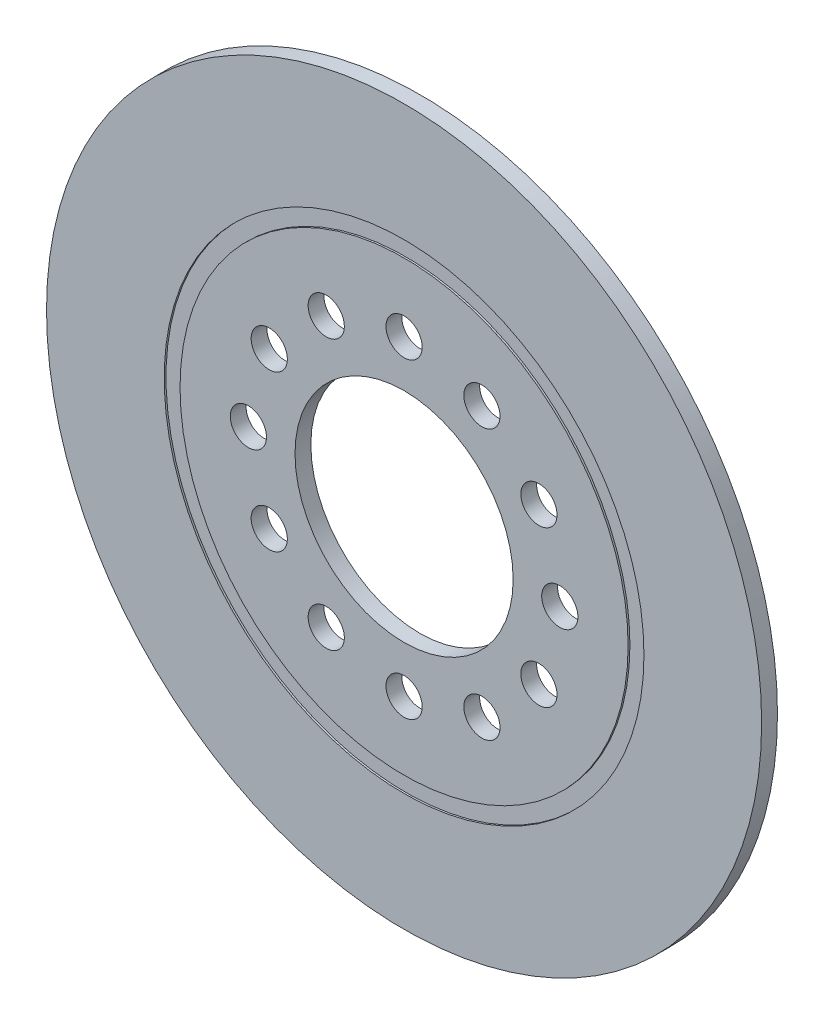
ISO-10303-21;
HEADER;
FILE_DESCRIPTION(('STEP AP214'),'2;1');
FILE_NAME('part.step','',(''),(''),'','','');
FILE_SCHEMA(('AUTOMOTIVE_DESIGN { 1 0 10303 214 1 1 1 1 }'));
ENDSEC;
DATA;
#1=APPLICATION_CONTEXT('core data for automotive mechanical design processes');
#2=APPLICATION_PROTOCOL_DEFINITION('international standard','automotive_design',2000,#1);
#3=PRODUCT_CONTEXT('',#1,'mechanical');
#4=PRODUCT('Part','Part','',(#3));
#5=PRODUCT_RELATED_PRODUCT_CATEGORY('part','',(#4));
#6=PRODUCT_DEFINITION_FORMATION('','',#4);
#7=PRODUCT_DEFINITION_CONTEXT('part definition',#1,'design');
#8=PRODUCT_DEFINITION('design','',#6,#7);
#9=PRODUCT_DEFINITION_SHAPE('','',#8);
#10=(LENGTH_UNIT() NAMED_UNIT(*) SI_UNIT(.MILLI.,.METRE.));
#11=(NAMED_UNIT(*) PLANE_ANGLE_UNIT() SI_UNIT($,.RADIAN.));
#12=(NAMED_UNIT(*) SI_UNIT($,.STERADIAN.) SOLID_ANGLE_UNIT());
#13=UNCERTAINTY_MEASURE_WITH_UNIT(LENGTH_MEASURE(1.E-05),#10,'distance_accuracy_value','');
#14=(GEOMETRIC_REPRESENTATION_CONTEXT(3) GLOBAL_UNCERTAINTY_ASSIGNED_CONTEXT((#13)) GLOBAL_UNIT_ASSIGNED_CONTEXT((#10,
#11,#12)) REPRESENTATION_CONTEXT('',''));
#15=CARTESIAN_POINT('',(0.,0.,0.));
#16=DIRECTION('',(0.,0.,1.));
#17=DIRECTION('',(1.,0.,0.));
#18=AXIS2_PLACEMENT_3D('',#15,#16,#17);
#19=CARTESIAN_POINT('',(0.,0.,3.5));
#20=DIRECTION('',(0.,0.,1.));
#21=DIRECTION('',(1.,0.,0.));
#22=AXIS2_PLACEMENT_3D('',#19,#20,#21);
#23=PLANE('',#22);
#24=CARTESIAN_POINT('',(34.4,0.,3.5));
#25=DIRECTION('',(0.,0.,1.));
#26=DIRECTION('',(1.,0.,0.));
#27=AXIS2_PLACEMENT_3D('',#24,#25,#26);
#28=CIRCLE('',#27,4.00000000000001);
#29=CARTESIAN_POINT('',(38.4,0.,3.5));
#30=VERTEX_POINT('',#29);
#31=EDGE_CURVE('E42',#30,#30,#28,.T.);
#32=ORIENTED_EDGE('',*,*,#31,.F.);
#33=EDGE_LOOP('',(#32));
#34=FACE_BOUND('',#33,.T.);
#35=CARTESIAN_POINT('',(29.7912738901849,17.1999999999996,3.5));
#36=DIRECTION('',(0.,0.,1.));
#37=DIRECTION('',(1.,0.,0.));
#38=AXIS2_PLACEMENT_3D('',#35,#36,#37);
#39=CIRCLE('',#38,4.);
#40=CARTESIAN_POINT('',(33.7912738901849,17.1999999999996,3.5));
#41=VERTEX_POINT('',#40);
#42=EDGE_CURVE('E101',#41,#41,#39,.T.);
#43=ORIENTED_EDGE('',*,*,#42,.F.);
#44=EDGE_LOOP('',(#43));
#45=FACE_BOUND('',#44,.T.);
#46=CARTESIAN_POINT('',(17.2000000000003,29.7912738901845,3.5));
#47=DIRECTION('',(0.,0.,1.));
#48=DIRECTION('',(1.,0.,0.));
#49=AXIS2_PLACEMENT_3D('',#46,#47,#48);
#50=CIRCLE('',#49,4.00000000000001);
#51=CARTESIAN_POINT('',(21.2000000000004,29.7912738901845,3.5));
#52=VERTEX_POINT('',#51);
#53=EDGE_CURVE('E108',#52,#52,#50,.T.);
#54=ORIENTED_EDGE('',*,*,#53,.F.);
#55=EDGE_LOOP('',(#54));
#56=FACE_BOUND('',#55,.T.);
#57=CARTESIAN_POINT('',(3.60320874168611E-13,34.4,3.5));
#58=DIRECTION('',(0.,0.,1.));
#59=DIRECTION('',(1.,0.,0.));
#60=AXIS2_PLACEMENT_3D('',#57,#58,#59);
#61=CIRCLE('',#60,4.00000000000001);
#62=CARTESIAN_POINT('',(4.00000000000037,34.4,3.5));
#63=VERTEX_POINT('',#62);
#64=EDGE_CURVE('E114',#63,#63,#61,.T.);
#65=ORIENTED_EDGE('',*,*,#64,.F.);
#66=EDGE_LOOP('',(#65));
#67=FACE_BOUND('',#66,.T.);
#68=CARTESIAN_POINT('',(-17.1999999999997,29.7912738901849,3.5));
#69=DIRECTION('',(0.,0.,1.));
#70=DIRECTION('',(1.,0.,0.));
#71=AXIS2_PLACEMENT_3D('',#68,#69,#70);
#72=CIRCLE('',#71,4.00000000000001);
#73=CARTESIAN_POINT('',(-13.1999999999997,29.7912738901849,3.5));
#74=VERTEX_POINT('',#73);
#75=EDGE_CURVE('E78',#74,#74,#72,.T.);
#76=ORIENTED_EDGE('',*,*,#75,.F.);
#77=EDGE_LOOP('',(#76));
#78=FACE_BOUND('',#77,.T.);
#79=CARTESIAN_POINT('',(0.,0.,3.5));
#80=DIRECTION('',(0.,0.,1.));
#81=DIRECTION('',(1.,0.,0.));
#82=AXIS2_PLACEMENT_3D('',#79,#80,#81);
#83=CIRCLE('',#82,24.1);
#84=CARTESIAN_POINT('',(24.1,0.,3.5));
#85=VERTEX_POINT('',#84);
#86=EDGE_CURVE('E47',#85,#85,#83,.T.);
#87=ORIENTED_EDGE('',*,*,#86,.F.);
#88=EDGE_LOOP('',(#87));
#89=FACE_BOUND('',#88,.T.);
#90=CARTESIAN_POINT('',(29.7912738901847,-17.2,3.5));
#91=DIRECTION('',(0.,0.,1.));
#92=DIRECTION('',(1.,0.,0.));
#93=AXIS2_PLACEMENT_3D('',#90,#91,#92);
#94=CIRCLE('',#93,4.00000000000001);
#95=CARTESIAN_POINT('',(33.7912738901847,-17.2,3.5));
#96=VERTEX_POINT('',#95);
#97=EDGE_CURVE('E66',#96,#96,#94,.T.);
#98=ORIENTED_EDGE('',*,*,#97,.F.);
#99=EDGE_LOOP('',(#98));
#100=FACE_BOUND('',#99,.T.);
#101=CARTESIAN_POINT('',(17.1999999999999,-29.7912738901847,3.5));
#102=DIRECTION('',(0.,0.,1.));
#103=DIRECTION('',(1.,0.,0.));
#104=AXIS2_PLACEMENT_3D('',#101,#102,#103);
#105=CIRCLE('',#104,4.00000000000001);
#106=CARTESIAN_POINT('',(21.1999999999999,-29.7912738901847,3.5));
#107=VERTEX_POINT('',#106);
#108=EDGE_CURVE('E60',#107,#107,#105,.T.);
#109=ORIENTED_EDGE('',*,*,#108,.F.);
#110=EDGE_LOOP('',(#109));
#111=FACE_BOUND('',#110,.T.);
#112=CARTESIAN_POINT('',(-1.20106958056204E-13,-34.4,3.5));
#113=DIRECTION('',(0.,0.,1.));
#114=DIRECTION('',(1.,0.,0.));
#115=AXIS2_PLACEMENT_3D('',#112,#113,#114);
#116=CIRCLE('',#115,4.00000000000001);
#117=CARTESIAN_POINT('',(3.99999999999989,-34.4,3.5));
#118=VERTEX_POINT('',#117);
#119=EDGE_CURVE('E53',#118,#118,#116,.T.);
#120=ORIENTED_EDGE('',*,*,#119,.F.);
#121=EDGE_LOOP('',(#120));
#122=FACE_BOUND('',#121,.T.);
#123=CARTESIAN_POINT('',(-17.2000000000001,-29.7912738901846,3.5));
#124=DIRECTION('',(0.,0.,1.));
#125=DIRECTION('',(1.,0.,0.));
#126=AXIS2_PLACEMENT_3D('',#123,#124,#125);
#127=CIRCLE('',#126,4.00000000000001);
#128=CARTESIAN_POINT('',(-13.2000000000001,-29.7912738901846,3.5));
#129=VERTEX_POINT('',#128);
#130=EDGE_CURVE('E54',#129,#129,#127,.T.);
#131=ORIENTED_EDGE('',*,*,#130,.F.);
#132=EDGE_LOOP('',(#131));
#133=FACE_BOUND('',#132,.T.);
#134=CARTESIAN_POINT('',(-29.7912738901848,-17.1999999999998,3.5));
#135=DIRECTION('',(0.,0.,1.));
#136=DIRECTION('',(1.,0.,0.));
#137=AXIS2_PLACEMENT_3D('',#134,#135,#136);
#138=CIRCLE('',#137,4.);
#139=CARTESIAN_POINT('',(-25.7912738901848,-17.1999999999998,3.5));
#140=VERTEX_POINT('',#139);
#141=EDGE_CURVE('E90',#140,#140,#138,.T.);
#142=ORIENTED_EDGE('',*,*,#141,.F.);
#143=EDGE_LOOP('',(#142));
#144=FACE_BOUND('',#143,.T.);
#145=CARTESIAN_POINT('',(-34.4,2.40213916112408E-13,3.5));
#146=DIRECTION('',(0.,0.,1.));
#147=DIRECTION('',(1.,0.,0.));
#148=AXIS2_PLACEMENT_3D('',#145,#146,#147);
#149=CIRCLE('',#148,4.00000000000001);
#150=CARTESIAN_POINT('',(-30.4,2.40213916112408E-13,3.5));
#151=VERTEX_POINT('',#150);
#152=EDGE_CURVE('E84',#151,#151,#149,.T.);
#153=ORIENTED_EDGE('',*,*,#152,.F.);
#154=EDGE_LOOP('',(#153));
#155=FACE_BOUND('',#154,.T.);
#156=CARTESIAN_POINT('',(-29.7912738901845,17.2000000000002,3.5));
#157=DIRECTION('',(0.,0.,1.));
#158=DIRECTION('',(1.,0.,0.));
#159=AXIS2_PLACEMENT_3D('',#156,#157,#158);
#160=CIRCLE('',#159,4.00000000000001);
#161=CARTESIAN_POINT('',(-25.7912738901845,17.2000000000002,3.5));
#162=VERTEX_POINT('',#161);
#163=EDGE_CURVE('E77',#162,#162,#160,.T.);
#164=ORIENTED_EDGE('',*,*,#163,.F.);
#165=EDGE_LOOP('',(#164));
#166=FACE_BOUND('',#165,.T.);
#167=CARTESIAN_POINT('',(0.,0.,3.5));
#168=DIRECTION('',(0.,0.,1.));
#169=DIRECTION('',(1.,0.,0.));
#170=AXIS2_PLACEMENT_3D('',#167,#168,#169);
#171=CIRCLE('',#170,49.5);
#172=CARTESIAN_POINT('',(49.5,0.,3.5));
#173=VERTEX_POINT('',#172);
#174=EDGE_CURVE('E128',#173,#173,#171,.T.);
#175=ORIENTED_EDGE('',*,*,#174,.T.);
#176=EDGE_LOOP('',(#175));
#177=FACE_BOUND('',#176,.T.);
#178=ADVANCED_FACE('F31',(#34,#45,#56,#67,#78,#89,#100,#111,#122,#133,#144,#155,#166,#177),#23,.T.);
#179=CARTESIAN_POINT('',(0.,0.,3.5));
#180=DIRECTION('',(0.,0.,-1.));
#181=DIRECTION('',(-1.,0.,0.));
#182=AXIS2_PLACEMENT_3D('',#179,#180,#181);
#183=CYLINDRICAL_SURFACE('',#182,79.);
#184=CARTESIAN_POINT('',(0.,0.,3.5));
#185=DIRECTION('',(0.,0.,1.));
#186=DIRECTION('',(1.,0.,0.));
#187=AXIS2_PLACEMENT_3D('',#184,#185,#186);
#188=CIRCLE('',#187,79.);
#189=CARTESIAN_POINT('',(79.,0.,3.5));
#190=VERTEX_POINT('',#189);
#191=EDGE_CURVE('E10',#190,#190,#188,.T.);
#192=ORIENTED_EDGE('',*,*,#191,.F.);
#193=EDGE_LOOP('',(#192));
#194=FACE_BOUND('',#193,.T.);
#195=CARTESIAN_POINT('',(0.,0.,0.));
#196=DIRECTION('',(0.,0.,1.));
#197=DIRECTION('',(1.,0.,0.));
#198=AXIS2_PLACEMENT_3D('',#195,#196,#197);
#199=CIRCLE('',#198,79.);
#200=CARTESIAN_POINT('',(79.,0.,0.));
#201=VERTEX_POINT('',#200);
#202=EDGE_CURVE('E35',#201,#201,#199,.T.);
#203=ORIENTED_EDGE('',*,*,#202,.T.);
#204=EDGE_LOOP('',(#203));
#205=FACE_BOUND('',#204,.T.);
#206=ADVANCED_FACE('F33',(#194,#205),#183,.T.);
#207=CARTESIAN_POINT('',(0.,0.,3.5));
#208=DIRECTION('',(0.,0.,1.));
#209=DIRECTION('',(1.,0.,0.));
#210=AXIS2_PLACEMENT_3D('',#207,#208,#209);
#211=CIRCLE('',#210,53.);
#212=CARTESIAN_POINT('',(53.,0.,3.5));
#213=VERTEX_POINT('',#212);
#214=EDGE_CURVE('E122',#213,#213,#211,.T.);
#215=ORIENTED_EDGE('',*,*,#214,.F.);
#216=EDGE_LOOP('',(#215));
#217=FACE_BOUND('',#216,.T.);
#218=ORIENTED_EDGE('',*,*,#191,.T.);
#219=EDGE_LOOP('',(#218));
#220=FACE_BOUND('',#219,.T.);
#221=ADVANCED_FACE('F150',(#217,#220),#23,.T.);
#222=CARTESIAN_POINT('',(0.,0.,0.));
#223=DIRECTION('',(0.,0.,1.));
#224=DIRECTION('',(1.,0.,0.));
#225=AXIS2_PLACEMENT_3D('',#222,#223,#224);
#226=PLANE('',#225);
#227=CARTESIAN_POINT('',(-29.7912738901845,17.2000000000002,0.));
#228=DIRECTION('',(0.,0.,1.));
#229=DIRECTION('',(1.,0.,0.));
#230=AXIS2_PLACEMENT_3D('',#227,#228,#229);
#231=CIRCLE('',#230,4.00000000000001);
#232=CARTESIAN_POINT('',(-25.7912738901845,17.2000000000002,0.));
#233=VERTEX_POINT('',#232);
#234=EDGE_CURVE('E74',#233,#233,#231,.T.);
#235=ORIENTED_EDGE('',*,*,#234,.T.);
#236=EDGE_LOOP('',(#235));
#237=FACE_BOUND('',#236,.T.);
#238=CARTESIAN_POINT('',(-34.4,2.40213916112408E-13,0.));
#239=DIRECTION('',(0.,0.,1.));
#240=DIRECTION('',(1.,0.,0.));
#241=AXIS2_PLACEMENT_3D('',#238,#239,#240);
#242=CIRCLE('',#241,4.00000000000001);
#243=CARTESIAN_POINT('',(-30.4,2.40213916112408E-13,0.));
#244=VERTEX_POINT('',#243);
#245=EDGE_CURVE('E81',#244,#244,#242,.T.);
#246=ORIENTED_EDGE('',*,*,#245,.T.);
#247=EDGE_LOOP('',(#246));
#248=FACE_BOUND('',#247,.T.);
#249=CARTESIAN_POINT('',(-29.7912738901848,-17.1999999999998,0.));
#250=DIRECTION('',(0.,0.,1.));
#251=DIRECTION('',(1.,0.,0.));
#252=AXIS2_PLACEMENT_3D('',#249,#250,#251);
#253=CIRCLE('',#252,4.);
#254=CARTESIAN_POINT('',(-25.7912738901848,-17.1999999999998,0.));
#255=VERTEX_POINT('',#254);
#256=EDGE_CURVE('E87',#255,#255,#253,.T.);
#257=ORIENTED_EDGE('',*,*,#256,.T.);
#258=EDGE_LOOP('',(#257));
#259=FACE_BOUND('',#258,.T.);
#260=CARTESIAN_POINT('',(-17.2000000000001,-29.7912738901846,0.));
#261=DIRECTION('',(0.,0.,1.));
#262=DIRECTION('',(1.,0.,0.));
#263=AXIS2_PLACEMENT_3D('',#260,#261,#262);
#264=CIRCLE('',#263,4.00000000000001);
#265=CARTESIAN_POINT('',(-13.2000000000001,-29.7912738901846,0.));
#266=VERTEX_POINT('',#265);
#267=EDGE_CURVE('E93',#266,#266,#264,.T.);
#268=ORIENTED_EDGE('',*,*,#267,.T.);
#269=EDGE_LOOP('',(#268));
#270=FACE_BOUND('',#269,.T.);
#271=CARTESIAN_POINT('',(-1.20106958056204E-13,-34.4,0.));
#272=DIRECTION('',(0.,0.,1.));
#273=DIRECTION('',(1.,0.,0.));
#274=AXIS2_PLACEMENT_3D('',#271,#272,#273);
#275=CIRCLE('',#274,4.00000000000001);
#276=CARTESIAN_POINT('',(3.99999999999989,-34.4,0.));
#277=VERTEX_POINT('',#276);
#278=EDGE_CURVE('E50',#277,#277,#275,.T.);
#279=ORIENTED_EDGE('',*,*,#278,.T.);
#280=EDGE_LOOP('',(#279));
#281=FACE_BOUND('',#280,.T.);
#282=CARTESIAN_POINT('',(17.1999999999999,-29.7912738901847,0.));
#283=DIRECTION('',(0.,0.,1.));
#284=DIRECTION('',(1.,0.,0.));
#285=AXIS2_PLACEMENT_3D('',#282,#283,#284);
#286=CIRCLE('',#285,4.00000000000001);
#287=CARTESIAN_POINT('',(21.1999999999999,-29.7912738901847,0.));
#288=VERTEX_POINT('',#287);
#289=EDGE_CURVE('E57',#288,#288,#286,.T.);
#290=ORIENTED_EDGE('',*,*,#289,.T.);
#291=EDGE_LOOP('',(#290));
#292=FACE_BOUND('',#291,.T.);
#293=CARTESIAN_POINT('',(29.7912738901847,-17.2,0.));
#294=DIRECTION('',(0.,0.,1.));
#295=DIRECTION('',(1.,0.,0.));
#296=AXIS2_PLACEMENT_3D('',#293,#294,#295);
#297=CIRCLE('',#296,4.00000000000001);
#298=CARTESIAN_POINT('',(33.7912738901847,-17.2,0.));
#299=VERTEX_POINT('',#298);
#300=EDGE_CURVE('E63',#299,#299,#297,.T.);
#301=ORIENTED_EDGE('',*,*,#300,.T.);
#302=EDGE_LOOP('',(#301));
#303=FACE_BOUND('',#302,.T.);
#304=CARTESIAN_POINT('',(0.,0.,0.));
#305=DIRECTION('',(0.,0.,1.));
#306=DIRECTION('',(1.,0.,0.));
#307=AXIS2_PLACEMENT_3D('',#304,#305,#306);
#308=CIRCLE('',#307,24.1);
#309=CARTESIAN_POINT('',(24.1,0.,0.));
#310=VERTEX_POINT('',#309);
#311=EDGE_CURVE('E69',#310,#310,#308,.T.);
#312=ORIENTED_EDGE('',*,*,#311,.T.);
#313=EDGE_LOOP('',(#312));
#314=FACE_BOUND('',#313,.T.);
#315=CARTESIAN_POINT('',(-17.1999999999997,29.7912738901849,0.));
#316=DIRECTION('',(0.,0.,1.));
#317=DIRECTION('',(1.,0.,0.));
#318=AXIS2_PLACEMENT_3D('',#315,#316,#317);
#319=CIRCLE('',#318,4.00000000000001);
#320=CARTESIAN_POINT('',(-13.1999999999997,29.7912738901849,0.));
#321=VERTEX_POINT('',#320);
#322=EDGE_CURVE('E117',#321,#321,#319,.T.);
#323=ORIENTED_EDGE('',*,*,#322,.T.);
#324=EDGE_LOOP('',(#323));
#325=FACE_BOUND('',#324,.T.);
#326=CARTESIAN_POINT('',(3.60320874168611E-13,34.4,0.));
#327=DIRECTION('',(0.,0.,1.));
#328=DIRECTION('',(1.,0.,0.));
#329=AXIS2_PLACEMENT_3D('',#326,#327,#328);
#330=CIRCLE('',#329,4.00000000000001);
#331=CARTESIAN_POINT('',(4.00000000000037,34.4,0.));
#332=VERTEX_POINT('',#331);
#333=EDGE_CURVE('E111',#332,#332,#330,.T.);
#334=ORIENTED_EDGE('',*,*,#333,.T.);
#335=EDGE_LOOP('',(#334));
#336=FACE_BOUND('',#335,.T.);
#337=CARTESIAN_POINT('',(17.2000000000003,29.7912738901845,0.));
#338=DIRECTION('',(0.,0.,1.));
#339=DIRECTION('',(1.,0.,0.));
#340=AXIS2_PLACEMENT_3D('',#337,#338,#339);
#341=CIRCLE('',#340,4.00000000000001);
#342=CARTESIAN_POINT('',(21.2000000000004,29.7912738901845,0.));
#343=VERTEX_POINT('',#342);
#344=EDGE_CURVE('E105',#343,#343,#341,.T.);
#345=ORIENTED_EDGE('',*,*,#344,.T.);
#346=EDGE_LOOP('',(#345));
#347=FACE_BOUND('',#346,.T.);
#348=CARTESIAN_POINT('',(29.7912738901849,17.1999999999996,0.));
#349=DIRECTION('',(0.,0.,1.));
#350=DIRECTION('',(1.,0.,0.));
#351=AXIS2_PLACEMENT_3D('',#348,#349,#350);
#352=CIRCLE('',#351,4.);
#353=CARTESIAN_POINT('',(33.7912738901849,17.1999999999996,0.));
#354=VERTEX_POINT('',#353);
#355=EDGE_CURVE('E98',#354,#354,#352,.T.);
#356=ORIENTED_EDGE('',*,*,#355,.T.);
#357=EDGE_LOOP('',(#356));
#358=FACE_BOUND('',#357,.T.);
#359=CARTESIAN_POINT('',(34.4,0.,0.));
#360=DIRECTION('',(0.,0.,1.));
#361=DIRECTION('',(1.,0.,0.));
#362=AXIS2_PLACEMENT_3D('',#359,#360,#361);
#363=CIRCLE('',#362,4.00000000000001);
#364=CARTESIAN_POINT('',(38.4,0.,0.));
#365=VERTEX_POINT('',#364);
#366=EDGE_CURVE('E44',#365,#365,#363,.T.);
#367=ORIENTED_EDGE('',*,*,#366,.T.);
#368=EDGE_LOOP('',(#367));
#369=FACE_BOUND('',#368,.T.);
#370=ORIENTED_EDGE('',*,*,#202,.F.);
#371=EDGE_LOOP('',(#370));
#372=FACE_BOUND('',#371,.T.);
#373=ADVANCED_FACE('F152',(#237,#248,#259,#270,#281,#292,#303,#314,#325,#336,#347,#358,#369,
#372),#226,.F.);
#374=CARTESIAN_POINT('',(34.4,0.,3.5));
#375=DIRECTION('',(0.,0.,-1.));
#376=DIRECTION('',(-1.,0.,0.));
#377=AXIS2_PLACEMENT_3D('',#374,#375,#376);
#378=CYLINDRICAL_SURFACE('',#377,4.00000000000001);
#379=ORIENTED_EDGE('',*,*,#31,.T.);
#380=EDGE_LOOP('',(#379));
#381=FACE_BOUND('',#380,.T.);
#382=ORIENTED_EDGE('',*,*,#366,.F.);
#383=EDGE_LOOP('',(#382));
#384=FACE_BOUND('',#383,.T.);
#385=ADVANCED_FACE('F158',(#381,#384),#378,.F.);
#386=CARTESIAN_POINT('',(29.7912738901849,17.1999999999996,3.5));
#387=DIRECTION('',(0.,0.,-1.));
#388=DIRECTION('',(-1.,0.,0.));
#389=AXIS2_PLACEMENT_3D('',#386,#387,#388);
#390=CYLINDRICAL_SURFACE('',#389,4.);
#391=ORIENTED_EDGE('',*,*,#42,.T.);
#392=EDGE_LOOP('',(#391));
#393=FACE_BOUND('',#392,.T.);
#394=ORIENTED_EDGE('',*,*,#355,.F.);
#395=EDGE_LOOP('',(#394));
#396=FACE_BOUND('',#395,.T.);
#397=ADVANCED_FACE('F210',(#393,#396),#390,.F.);
#398=CARTESIAN_POINT('',(17.2000000000003,29.7912738901845,3.5));
#399=DIRECTION('',(0.,0.,-1.));
#400=DIRECTION('',(-1.,0.,0.));
#401=AXIS2_PLACEMENT_3D('',#398,#399,#400);
#402=CYLINDRICAL_SURFACE('',#401,4.00000000000001);
#403=ORIENTED_EDGE('',*,*,#53,.T.);
#404=EDGE_LOOP('',(#403));
#405=FACE_BOUND('',#404,.T.);
#406=ORIENTED_EDGE('',*,*,#344,.F.);
#407=EDGE_LOOP('',(#406));
#408=FACE_BOUND('',#407,.T.);
#409=ADVANCED_FACE('F206',(#405,#408),#402,.F.);
#410=CARTESIAN_POINT('',(3.60320874168611E-13,34.4,3.5));
#411=DIRECTION('',(0.,0.,-1.));
#412=DIRECTION('',(-1.,0.,0.));
#413=AXIS2_PLACEMENT_3D('',#410,#411,#412);
#414=CYLINDRICAL_SURFACE('',#413,4.00000000000001);
#415=ORIENTED_EDGE('',*,*,#64,.T.);
#416=EDGE_LOOP('',(#415));
#417=FACE_BOUND('',#416,.T.);
#418=ORIENTED_EDGE('',*,*,#333,.F.);
#419=EDGE_LOOP('',(#418));
#420=FACE_BOUND('',#419,.T.);
#421=ADVANCED_FACE('F202',(#417,#420),#414,.F.);
#422=CARTESIAN_POINT('',(-17.1999999999997,29.7912738901849,3.5));
#423=DIRECTION('',(0.,0.,-1.));
#424=DIRECTION('',(-1.,0.,0.));
#425=AXIS2_PLACEMENT_3D('',#422,#423,#424);
#426=CYLINDRICAL_SURFACE('',#425,4.00000000000001);
#427=ORIENTED_EDGE('',*,*,#75,.T.);
#428=EDGE_LOOP('',(#427));
#429=FACE_BOUND('',#428,.T.);
#430=ORIENTED_EDGE('',*,*,#322,.F.);
#431=EDGE_LOOP('',(#430));
#432=FACE_BOUND('',#431,.T.);
#433=ADVANCED_FACE('F198',(#429,#432),#426,.F.);
#434=CARTESIAN_POINT('',(0.,0.,3.5));
#435=DIRECTION('',(0.,0.,-1.));
#436=DIRECTION('',(-1.,0.,0.));
#437=AXIS2_PLACEMENT_3D('',#434,#435,#436);
#438=CYLINDRICAL_SURFACE('',#437,24.1);
#439=ORIENTED_EDGE('',*,*,#86,.T.);
#440=EDGE_LOOP('',(#439));
#441=FACE_BOUND('',#440,.T.);
#442=ORIENTED_EDGE('',*,*,#311,.F.);
#443=EDGE_LOOP('',(#442));
#444=FACE_BOUND('',#443,.T.);
#445=ADVANCED_FACE('F201',(#441,#444),#438,.F.);
#446=CARTESIAN_POINT('',(29.7912738901847,-17.2,3.5));
#447=DIRECTION('',(0.,0.,-1.));
#448=DIRECTION('',(-1.,0.,0.));
#449=AXIS2_PLACEMENT_3D('',#446,#447,#448);
#450=CYLINDRICAL_SURFACE('',#449,4.00000000000001);
#451=ORIENTED_EDGE('',*,*,#97,.T.);
#452=EDGE_LOOP('',(#451));
#453=FACE_BOUND('',#452,.T.);
#454=ORIENTED_EDGE('',*,*,#300,.F.);
#455=EDGE_LOOP('',(#454));
#456=FACE_BOUND('',#455,.T.);
#457=ADVANCED_FACE('F233',(#453,#456),#450,.F.);
#458=CARTESIAN_POINT('',(17.1999999999999,-29.7912738901847,3.5));
#459=DIRECTION('',(0.,0.,-1.));
#460=DIRECTION('',(-1.,0.,0.));
#461=AXIS2_PLACEMENT_3D('',#458,#459,#460);
#462=CYLINDRICAL_SURFACE('',#461,4.00000000000001);
#463=ORIENTED_EDGE('',*,*,#108,.T.);
#464=EDGE_LOOP('',(#463));
#465=FACE_BOUND('',#464,.T.);
#466=ORIENTED_EDGE('',*,*,#289,.F.);
#467=EDGE_LOOP('',(#466));
#468=FACE_BOUND('',#467,.T.);
#469=ADVANCED_FACE('F237',(#465,#468),#462,.F.);
#470=CARTESIAN_POINT('',(-1.20106958056204E-13,-34.4,3.5));
#471=DIRECTION('',(0.,0.,-1.));
#472=DIRECTION('',(-1.,0.,0.));
#473=AXIS2_PLACEMENT_3D('',#470,#471,#472);
#474=CYLINDRICAL_SURFACE('',#473,4.00000000000001);
#475=ORIENTED_EDGE('',*,*,#119,.T.);
#476=EDGE_LOOP('',(#475));
#477=FACE_BOUND('',#476,.T.);
#478=ORIENTED_EDGE('',*,*,#278,.F.);
#479=EDGE_LOOP('',(#478));
#480=FACE_BOUND('',#479,.T.);
#481=ADVANCED_FACE('F219',(#477,#480),#474,.F.);
#482=CARTESIAN_POINT('',(-17.2000000000001,-29.7912738901846,3.5));
#483=DIRECTION('',(0.,0.,-1.));
#484=DIRECTION('',(-1.,0.,0.));
#485=AXIS2_PLACEMENT_3D('',#482,#483,#484);
#486=CYLINDRICAL_SURFACE('',#485,4.00000000000001);
#487=ORIENTED_EDGE('',*,*,#130,.T.);
#488=EDGE_LOOP('',(#487));
#489=FACE_BOUND('',#488,.T.);
#490=ORIENTED_EDGE('',*,*,#267,.F.);
#491=EDGE_LOOP('',(#490));
#492=FACE_BOUND('',#491,.T.);
#493=ADVANCED_FACE('F215',(#489,#492),#486,.F.);
#494=CARTESIAN_POINT('',(-29.7912738901848,-17.1999999999998,3.5));
#495=DIRECTION('',(0.,0.,-1.));
#496=DIRECTION('',(-1.,0.,0.));
#497=AXIS2_PLACEMENT_3D('',#494,#495,#496);
#498=CYLINDRICAL_SURFACE('',#497,4.);
#499=ORIENTED_EDGE('',*,*,#141,.T.);
#500=EDGE_LOOP('',(#499));
#501=FACE_BOUND('',#500,.T.);
#502=ORIENTED_EDGE('',*,*,#256,.F.);
#503=EDGE_LOOP('',(#502));
#504=FACE_BOUND('',#503,.T.);
#505=ADVANCED_FACE('F218',(#501,#504),#498,.F.);
#506=CARTESIAN_POINT('',(-34.4,2.40213916112408E-13,3.5));
#507=DIRECTION('',(0.,0.,-1.));
#508=DIRECTION('',(-1.,0.,0.));
#509=AXIS2_PLACEMENT_3D('',#506,#507,#508);
#510=CYLINDRICAL_SURFACE('',#509,4.00000000000001);
#511=ORIENTED_EDGE('',*,*,#152,.T.);
#512=EDGE_LOOP('',(#511));
#513=FACE_BOUND('',#512,.T.);
#514=ORIENTED_EDGE('',*,*,#245,.F.);
#515=EDGE_LOOP('',(#514));
#516=FACE_BOUND('',#515,.T.);
#517=ADVANCED_FACE('F223',(#513,#516),#510,.F.);
#518=CARTESIAN_POINT('',(-29.7912738901845,17.2000000000002,3.5));
#519=DIRECTION('',(0.,0.,-1.));
#520=DIRECTION('',(-1.,0.,0.));
#521=AXIS2_PLACEMENT_3D('',#518,#519,#520);
#522=CYLINDRICAL_SURFACE('',#521,4.00000000000001);
#523=ORIENTED_EDGE('',*,*,#163,.T.);
#524=EDGE_LOOP('',(#523));
#525=FACE_BOUND('',#524,.T.);
#526=ORIENTED_EDGE('',*,*,#234,.F.);
#527=EDGE_LOOP('',(#526));
#528=FACE_BOUND('',#527,.T.);
#529=ADVANCED_FACE('F146',(#525,#528),#522,.F.);
#530=CARTESIAN_POINT('',(0.,0.,3.1));
#531=DIRECTION('',(0.,0.,1.));
#532=DIRECTION('',(1.,0.,0.));
#533=AXIS2_PLACEMENT_3D('',#530,#531,#532);
#534=CYLINDRICAL_SURFACE('',#533,53.);
#535=CARTESIAN_POINT('',(0.,0.,3.1));
#536=DIRECTION('',(0.,0.,1.));
#537=DIRECTION('',(1.,0.,0.));
#538=AXIS2_PLACEMENT_3D('',#535,#536,#537);
#539=CIRCLE('',#538,53.);
#540=CARTESIAN_POINT('',(53.,0.,3.1));
#541=VERTEX_POINT('',#540);
#542=EDGE_CURVE('E102',#541,#541,#539,.T.);
#543=ORIENTED_EDGE('',*,*,#542,.F.);
#544=EDGE_LOOP('',(#543));
#545=FACE_BOUND('',#544,.T.);
#546=ORIENTED_EDGE('',*,*,#214,.T.);
#547=EDGE_LOOP('',(#546));
#548=FACE_BOUND('',#547,.T.);
#549=ADVANCED_FACE('F140',(#545,#548),#534,.F.);
#550=CARTESIAN_POINT('',(0.,0.,3.1));
#551=DIRECTION('',(0.,0.,1.));
#552=DIRECTION('',(1.,0.,0.));
#553=AXIS2_PLACEMENT_3D('',#550,#551,#552);
#554=PLANE('',#553);
#555=CARTESIAN_POINT('',(0.,0.,3.1));
#556=DIRECTION('',(0.,0.,1.));
#557=DIRECTION('',(1.,0.,0.));
#558=AXIS2_PLACEMENT_3D('',#555,#556,#557);
#559=CIRCLE('',#558,49.5);
#560=CARTESIAN_POINT('',(49.5,0.,3.1));
#561=VERTEX_POINT('',#560);
#562=EDGE_CURVE('E125',#561,#561,#559,.T.);
#563=ORIENTED_EDGE('',*,*,#562,.F.);
#564=EDGE_LOOP('',(#563));
#565=FACE_BOUND('',#564,.T.);
#566=ORIENTED_EDGE('',*,*,#542,.T.);
#567=EDGE_LOOP('',(#566));
#568=FACE_BOUND('',#567,.T.);
#569=ADVANCED_FACE('F137',(#565,#568),#554,.T.);
#570=CARTESIAN_POINT('',(0.,0.,3.1));
#571=DIRECTION('',(0.,0.,1.));
#572=DIRECTION('',(1.,0.,0.));
#573=AXIS2_PLACEMENT_3D('',#570,#571,#572);
#574=CYLINDRICAL_SURFACE('',#573,49.5);
#575=ORIENTED_EDGE('',*,*,#562,.T.);
#576=EDGE_LOOP('',(#575));
#577=FACE_BOUND('',#576,.T.);
#578=ORIENTED_EDGE('',*,*,#174,.F.);
#579=EDGE_LOOP('',(#578));
#580=FACE_BOUND('',#579,.T.);
#581=ADVANCED_FACE('F134',(#577,#580),#574,.T.);
#582=CLOSED_SHELL('',(#178,#206,#221,#373,#385,#397,#409,#421,#433,#445,#457,#469,#481,#493,
#505,#517,#529,#549,#569,#581));
#583=MANIFOLD_SOLID_BREP('B2',#582);
#584=ADVANCED_BREP_SHAPE_REPRESENTATION('',(#18,#583),#14);
#585=SHAPE_DEFINITION_REPRESENTATION(#9,#584);
ENDSEC;
END-ISO-10303-21;
